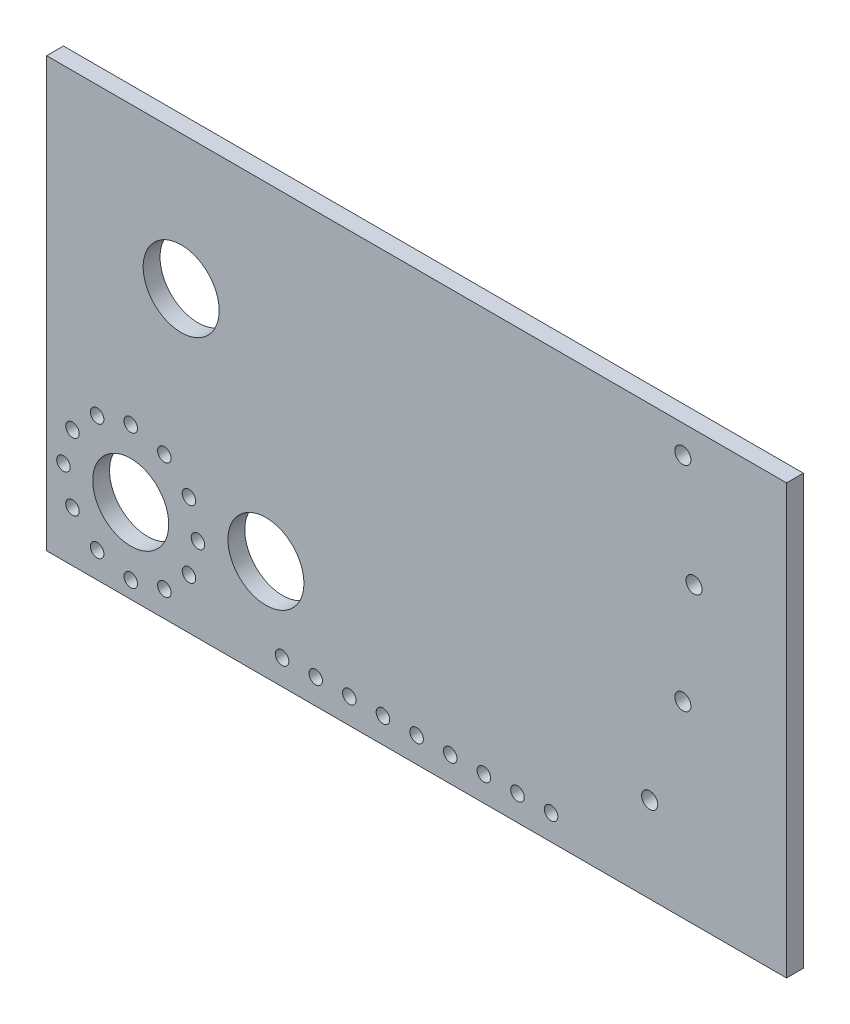
ISO-10303-21;
HEADER;
FILE_DESCRIPTION(('STEP AP214'),'2;1');
FILE_NAME('part.step','',(''),(''),'','','');
FILE_SCHEMA(('AUTOMOTIVE_DESIGN { 1 0 10303 214 1 1 1 1 }'));
ENDSEC;
DATA;
#1=APPLICATION_CONTEXT('core data for automotive mechanical design processes');
#2=APPLICATION_PROTOCOL_DEFINITION('international standard','automotive_design',2000,#1);
#3=PRODUCT_CONTEXT('',#1,'mechanical');
#4=PRODUCT('Part','Part','',(#3));
#5=PRODUCT_RELATED_PRODUCT_CATEGORY('part','',(#4));
#6=PRODUCT_DEFINITION_FORMATION('','',#4);
#7=PRODUCT_DEFINITION_CONTEXT('part definition',#1,'design');
#8=PRODUCT_DEFINITION('design','',#6,#7);
#9=PRODUCT_DEFINITION_SHAPE('','',#8);
#10=(LENGTH_UNIT() NAMED_UNIT(*) SI_UNIT(.MILLI.,.METRE.));
#11=(NAMED_UNIT(*) PLANE_ANGLE_UNIT() SI_UNIT($,.RADIAN.));
#12=(NAMED_UNIT(*) SI_UNIT($,.STERADIAN.) SOLID_ANGLE_UNIT());
#13=UNCERTAINTY_MEASURE_WITH_UNIT(LENGTH_MEASURE(1.E-05),#10,'distance_accuracy_value','');
#14=(GEOMETRIC_REPRESENTATION_CONTEXT(3) GLOBAL_UNCERTAINTY_ASSIGNED_CONTEXT((#13)) GLOBAL_UNIT_ASSIGNED_CONTEXT((#10,
#11,#12)) REPRESENTATION_CONTEXT('',''));
#15=CARTESIAN_POINT('',(0.,0.,0.));
#16=DIRECTION('',(0.,0.,1.));
#17=DIRECTION('',(1.,0.,0.));
#18=AXIS2_PLACEMENT_3D('',#15,#16,#17);
#19=CARTESIAN_POINT('',(0.,0.,6.35));
#20=DIRECTION('',(0.,0.,-1.));
#21=DIRECTION('',(-1.,0.,0.));
#22=AXIS2_PLACEMENT_3D('',#19,#20,#21);
#23=PLANE('',#22);
#24=DIRECTION('',(1.,0.,0.));
#25=VECTOR('',#24,1.);
#26=CARTESIAN_POINT('',(0.,-9.525,6.35));
#27=LINE('',#26,#25);
#28=CARTESIAN_POINT('',(-139.7,-9.52500000000002,6.35));
#29=VERTEX_POINT('',#28);
#30=CARTESIAN_POINT('',(139.7,-9.525,6.35));
#31=VERTEX_POINT('',#30);
#32=EDGE_CURVE('E56',#29,#31,#27,.T.);
#33=ORIENTED_EDGE('',*,*,#32,.T.);
#34=DIRECTION('',(0.,1.,0.));
#35=VECTOR('',#34,1.);
#36=CARTESIAN_POINT('',(139.7,152.4,6.35));
#37=LINE('',#36,#35);
#38=CARTESIAN_POINT('',(139.7,152.4,6.35));
#39=VERTEX_POINT('',#38);
#40=EDGE_CURVE('E87',#31,#39,#37,.T.);
#41=ORIENTED_EDGE('',*,*,#40,.T.);
#42=DIRECTION('',(-1.,0.,0.));
#43=VECTOR('',#42,1.);
#44=CARTESIAN_POINT('',(-139.7,152.4,6.35));
#45=LINE('',#44,#43);
#46=CARTESIAN_POINT('',(-139.7,152.4,6.35));
#47=VERTEX_POINT('',#46);
#48=EDGE_CURVE('E91',#39,#47,#45,.T.);
#49=ORIENTED_EDGE('',*,*,#48,.T.);
#50=DIRECTION('',(0.,-1.,0.));
#51=VECTOR('',#50,1.);
#52=CARTESIAN_POINT('',(-139.7,-9.52500000000002,6.35));
#53=LINE('',#52,#51);
#54=EDGE_CURVE('E98',#47,#29,#53,.T.);
#55=ORIENTED_EDGE('',*,*,#54,.T.);
#56=EDGE_LOOP('',(#33,#41,#49,#55));
#57=FACE_BOUND('',#56,.T.);
#58=CARTESIAN_POINT('',(0.,0.,6.35));
#59=DIRECTION('',(0.,0.,1.));
#60=DIRECTION('',(1.,0.,0.));
#61=AXIS2_PLACEMENT_3D('',#58,#59,#60);
#62=CIRCLE('',#61,2.5527);
#63=CARTESIAN_POINT('',(2.5527,0.,6.35));
#64=VERTEX_POINT('',#63);
#65=EDGE_CURVE('E105',#64,#64,#62,.T.);
#66=ORIENTED_EDGE('',*,*,#65,.F.);
#67=EDGE_LOOP('',(#66));
#68=FACE_BOUND('',#67,.T.);
#69=CARTESIAN_POINT('',(12.7,0.,6.35));
#70=DIRECTION('',(0.,0.,1.));
#71=DIRECTION('',(1.,0.,0.));
#72=AXIS2_PLACEMENT_3D('',#69,#70,#71);
#73=CIRCLE('',#72,2.5527);
#74=CARTESIAN_POINT('',(15.2527,0.,6.35));
#75=VERTEX_POINT('',#74);
#76=EDGE_CURVE('E406',#75,#75,#73,.T.);
#77=ORIENTED_EDGE('',*,*,#76,.F.);
#78=EDGE_LOOP('',(#77));
#79=FACE_BOUND('',#78,.T.);
#80=CARTESIAN_POINT('',(25.4,0.,6.35));
#81=DIRECTION('',(0.,0.,1.));
#82=DIRECTION('',(1.,0.,0.));
#83=AXIS2_PLACEMENT_3D('',#80,#81,#82);
#84=CIRCLE('',#83,2.5527);
#85=CARTESIAN_POINT('',(27.9527,0.,6.35));
#86=VERTEX_POINT('',#85);
#87=EDGE_CURVE('E400',#86,#86,#84,.T.);
#88=ORIENTED_EDGE('',*,*,#87,.F.);
#89=EDGE_LOOP('',(#88));
#90=FACE_BOUND('',#89,.T.);
#91=CARTESIAN_POINT('',(38.1,0.,6.35));
#92=DIRECTION('',(0.,0.,1.));
#93=DIRECTION('',(1.,0.,0.));
#94=AXIS2_PLACEMENT_3D('',#91,#92,#93);
#95=CIRCLE('',#94,2.5527);
#96=CARTESIAN_POINT('',(40.6527,0.,6.35));
#97=VERTEX_POINT('',#96);
#98=EDGE_CURVE('E394',#97,#97,#95,.T.);
#99=ORIENTED_EDGE('',*,*,#98,.F.);
#100=EDGE_LOOP('',(#99));
#101=FACE_BOUND('',#100,.T.);
#102=CARTESIAN_POINT('',(50.8,0.,6.35));
#103=DIRECTION('',(0.,0.,1.));
#104=DIRECTION('',(1.,0.,0.));
#105=AXIS2_PLACEMENT_3D('',#102,#103,#104);
#106=CIRCLE('',#105,2.5527);
#107=CARTESIAN_POINT('',(53.3527,0.,6.35));
#108=VERTEX_POINT('',#107);
#109=EDGE_CURVE('E388',#108,#108,#106,.T.);
#110=ORIENTED_EDGE('',*,*,#109,.F.);
#111=EDGE_LOOP('',(#110));
#112=FACE_BOUND('',#111,.T.);
#113=CARTESIAN_POINT('',(-50.8,0.,6.35));
#114=DIRECTION('',(0.,0.,1.));
#115=DIRECTION('',(-1.,0.,0.));
#116=AXIS2_PLACEMENT_3D('',#113,#114,#115);
#117=CIRCLE('',#116,2.5527);
#118=CARTESIAN_POINT('',(-53.3527,0.,6.35));
#119=VERTEX_POINT('',#118);
#120=EDGE_CURVE('E382',#119,#119,#117,.T.);
#121=ORIENTED_EDGE('',*,*,#120,.F.);
#122=EDGE_LOOP('',(#121));
#123=FACE_BOUND('',#122,.T.);
#124=CARTESIAN_POINT('',(-38.1,0.,6.35));
#125=DIRECTION('',(0.,0.,1.));
#126=DIRECTION('',(-1.,0.,0.));
#127=AXIS2_PLACEMENT_3D('',#124,#125,#126);
#128=CIRCLE('',#127,2.5527);
#129=CARTESIAN_POINT('',(-40.6527,0.,6.35));
#130=VERTEX_POINT('',#129);
#131=EDGE_CURVE('E376',#130,#130,#128,.T.);
#132=ORIENTED_EDGE('',*,*,#131,.F.);
#133=EDGE_LOOP('',(#132));
#134=FACE_BOUND('',#133,.T.);
#135=CARTESIAN_POINT('',(-25.4,0.,6.35));
#136=DIRECTION('',(0.,0.,1.));
#137=DIRECTION('',(-1.,0.,0.));
#138=AXIS2_PLACEMENT_3D('',#135,#136,#137);
#139=CIRCLE('',#138,2.5527);
#140=CARTESIAN_POINT('',(-27.9527,0.,6.35));
#141=VERTEX_POINT('',#140);
#142=EDGE_CURVE('E370',#141,#141,#139,.T.);
#143=ORIENTED_EDGE('',*,*,#142,.F.);
#144=EDGE_LOOP('',(#143));
#145=FACE_BOUND('',#144,.T.);
#146=CARTESIAN_POINT('',(-12.7,0.,6.35));
#147=DIRECTION('',(0.,0.,1.));
#148=DIRECTION('',(-1.,0.,0.));
#149=AXIS2_PLACEMENT_3D('',#146,#147,#148);
#150=CIRCLE('',#149,2.5527);
#151=CARTESIAN_POINT('',(-15.2527,0.,6.35));
#152=VERTEX_POINT('',#151);
#153=EDGE_CURVE('E364',#152,#152,#150,.T.);
#154=ORIENTED_EDGE('',*,*,#153,.F.);
#155=EDGE_LOOP('',(#154));
#156=FACE_BOUND('',#155,.T.);
#157=CARTESIAN_POINT('',(-82.55,22.225,6.35));
#158=DIRECTION('',(0.,0.,1.));
#159=DIRECTION('',(1.,0.,0.));
#160=AXIS2_PLACEMENT_3D('',#157,#158,#159);
#161=CIRCLE('',#160,2.55270000000001);
#162=CARTESIAN_POINT('',(-79.9973,22.225,6.35));
#163=VERTEX_POINT('',#162);
#164=EDGE_CURVE('E358',#163,#163,#161,.T.);
#165=ORIENTED_EDGE('',*,*,#164,.F.);
#166=EDGE_LOOP('',(#165));
#167=FACE_BOUND('',#166,.T.);
#168=CARTESIAN_POINT('',(-85.9529547438752,9.52499999999998,6.35));
#169=DIRECTION('',(0.,0.,1.));
#170=DIRECTION('',(1.,0.,0.));
#171=AXIS2_PLACEMENT_3D('',#168,#169,#170);
#172=CIRCLE('',#171,2.55269999999998);
#173=CARTESIAN_POINT('',(-83.4002547438753,9.52499999999998,6.35));
#174=VERTEX_POINT('',#173);
#175=EDGE_CURVE('E352',#174,#174,#172,.T.);
#176=ORIENTED_EDGE('',*,*,#175,.F.);
#177=EDGE_LOOP('',(#176));
#178=FACE_BOUND('',#177,.T.);
#179=CARTESIAN_POINT('',(-95.25,0.227954743875255,6.35));
#180=DIRECTION('',(0.,0.,1.));
#181=DIRECTION('',(1.,0.,0.));
#182=AXIS2_PLACEMENT_3D('',#179,#180,#181);
#183=CIRCLE('',#182,2.55270000000003);
#184=CARTESIAN_POINT('',(-92.6973,0.227954743875255,6.35));
#185=VERTEX_POINT('',#184);
#186=EDGE_CURVE('E346',#185,#185,#183,.T.);
#187=ORIENTED_EDGE('',*,*,#186,.F.);
#188=EDGE_LOOP('',(#187));
#189=FACE_BOUND('',#188,.T.);
#190=CARTESIAN_POINT('',(-107.95,-3.17500000000003,6.35));
#191=DIRECTION('',(0.,0.,1.));
#192=DIRECTION('',(1.,0.,0.));
#193=AXIS2_PLACEMENT_3D('',#190,#191,#192);
#194=CIRCLE('',#193,2.55269999999998);
#195=CARTESIAN_POINT('',(-105.3973,-3.17500000000003,6.35));
#196=VERTEX_POINT('',#195);
#197=EDGE_CURVE('E340',#196,#196,#194,.T.);
#198=ORIENTED_EDGE('',*,*,#197,.F.);
#199=EDGE_LOOP('',(#198));
#200=FACE_BOUND('',#199,.T.);
#201=CARTESIAN_POINT('',(-120.65,0.227954743875235,6.35));
#202=DIRECTION('',(0.,0.,1.));
#203=DIRECTION('',(1.,0.,0.));
#204=AXIS2_PLACEMENT_3D('',#201,#202,#203);
#205=CIRCLE('',#204,2.55269999999998);
#206=CARTESIAN_POINT('',(-118.0973,0.227954743875235,6.35));
#207=VERTEX_POINT('',#206);
#208=EDGE_CURVE('E334',#207,#207,#205,.T.);
#209=ORIENTED_EDGE('',*,*,#208,.F.);
#210=EDGE_LOOP('',(#209));
#211=FACE_BOUND('',#210,.T.);
#212=CARTESIAN_POINT('',(-129.947045256125,9.52499999999998,6.35));
#213=DIRECTION('',(0.,0.,1.));
#214=DIRECTION('',(1.,0.,0.));
#215=AXIS2_PLACEMENT_3D('',#212,#213,#214);
#216=CIRCLE('',#215,2.55270000000001);
#217=CARTESIAN_POINT('',(-127.394345256125,9.52499999999998,6.35));
#218=VERTEX_POINT('',#217);
#219=EDGE_CURVE('E328',#218,#218,#216,.T.);
#220=ORIENTED_EDGE('',*,*,#219,.F.);
#221=EDGE_LOOP('',(#220));
#222=FACE_BOUND('',#221,.T.);
#223=CARTESIAN_POINT('',(-133.35,22.225,6.35));
#224=DIRECTION('',(0.,0.,1.));
#225=DIRECTION('',(1.,0.,0.));
#226=AXIS2_PLACEMENT_3D('',#223,#224,#225);
#227=CIRCLE('',#226,2.55270000000001);
#228=CARTESIAN_POINT('',(-130.7973,22.225,6.35));
#229=VERTEX_POINT('',#228);
#230=EDGE_CURVE('E322',#229,#229,#227,.T.);
#231=ORIENTED_EDGE('',*,*,#230,.F.);
#232=EDGE_LOOP('',(#231));
#233=FACE_BOUND('',#232,.T.);
#234=CARTESIAN_POINT('',(-129.947045256125,34.925,6.35));
#235=DIRECTION('',(0.,0.,1.));
#236=DIRECTION('',(1.,0.,0.));
#237=AXIS2_PLACEMENT_3D('',#234,#235,#236);
#238=CIRCLE('',#237,2.55270000000004);
#239=CARTESIAN_POINT('',(-127.394345256125,34.925,6.35));
#240=VERTEX_POINT('',#239);
#241=EDGE_CURVE('E316',#240,#240,#238,.T.);
#242=ORIENTED_EDGE('',*,*,#241,.F.);
#243=EDGE_LOOP('',(#242));
#244=FACE_BOUND('',#243,.T.);
#245=CARTESIAN_POINT('',(-120.65,44.2220452561247,6.35));
#246=DIRECTION('',(0.,0.,1.));
#247=DIRECTION('',(1.,0.,0.));
#248=AXIS2_PLACEMENT_3D('',#245,#246,#247);
#249=CIRCLE('',#248,2.55270000000003);
#250=CARTESIAN_POINT('',(-118.0973,44.2220452561247,6.35));
#251=VERTEX_POINT('',#250);
#252=EDGE_CURVE('E310',#251,#251,#249,.T.);
#253=ORIENTED_EDGE('',*,*,#252,.F.);
#254=EDGE_LOOP('',(#253));
#255=FACE_BOUND('',#254,.T.);
#256=CARTESIAN_POINT('',(-107.95,47.625,6.35));
#257=DIRECTION('',(0.,0.,1.));
#258=DIRECTION('',(1.,0.,0.));
#259=AXIS2_PLACEMENT_3D('',#256,#257,#258);
#260=CIRCLE('',#259,2.55269999999998);
#261=CARTESIAN_POINT('',(-105.3973,47.625,6.35));
#262=VERTEX_POINT('',#261);
#263=EDGE_CURVE('E304',#262,#262,#260,.T.);
#264=ORIENTED_EDGE('',*,*,#263,.F.);
#265=EDGE_LOOP('',(#264));
#266=FACE_BOUND('',#265,.T.);
#267=CARTESIAN_POINT('',(-95.25,44.2220452561247,6.35));
#268=DIRECTION('',(0.,0.,1.));
#269=DIRECTION('',(1.,0.,0.));
#270=AXIS2_PLACEMENT_3D('',#267,#268,#269);
#271=CIRCLE('',#270,2.55270000000003);
#272=CARTESIAN_POINT('',(-92.6973,44.2220452561247,6.35));
#273=VERTEX_POINT('',#272);
#274=EDGE_CURVE('E298',#273,#273,#271,.T.);
#275=ORIENTED_EDGE('',*,*,#274,.F.);
#276=EDGE_LOOP('',(#275));
#277=FACE_BOUND('',#276,.T.);
#278=CARTESIAN_POINT('',(-85.9529547438752,34.925,6.35));
#279=DIRECTION('',(0.,0.,1.));
#280=DIRECTION('',(1.,0.,0.));
#281=AXIS2_PLACEMENT_3D('',#278,#279,#280);
#282=CIRCLE('',#281,2.55270000000003);
#283=CARTESIAN_POINT('',(-83.4002547438752,34.925,6.35));
#284=VERTEX_POINT('',#283);
#285=EDGE_CURVE('E292',#284,#284,#282,.T.);
#286=ORIENTED_EDGE('',*,*,#285,.F.);
#287=EDGE_LOOP('',(#286));
#288=FACE_BOUND('',#287,.T.);
#289=CARTESIAN_POINT('',(100.54273657212,141.867296719128,6.35));
#290=DIRECTION('',(0.,0.,1.));
#291=DIRECTION('',(1.,0.,0.));
#292=AXIS2_PLACEMENT_3D('',#289,#290,#291);
#293=CIRCLE('',#292,3.048);
#294=CARTESIAN_POINT('',(103.59073657212,141.867296719128,6.35));
#295=VERTEX_POINT('',#294);
#296=EDGE_CURVE('E286',#295,#295,#293,.T.);
#297=ORIENTED_EDGE('',*,*,#296,.F.);
#298=EDGE_LOOP('',(#297));
#299=FACE_BOUND('',#298,.T.);
#300=CARTESIAN_POINT('',(104.775,101.6,6.35));
#301=DIRECTION('',(0.,0.,1.));
#302=DIRECTION('',(1.,0.,0.));
#303=AXIS2_PLACEMENT_3D('',#300,#301,#302);
#304=CIRCLE('',#303,3.048);
#305=CARTESIAN_POINT('',(107.823,101.6,6.35));
#306=VERTEX_POINT('',#305);
#307=EDGE_CURVE('E280',#306,#306,#304,.T.);
#308=ORIENTED_EDGE('',*,*,#307,.F.);
#309=EDGE_LOOP('',(#308));
#310=FACE_BOUND('',#309,.T.);
#311=CARTESIAN_POINT('',(100.54273657212,61.3327032808718,6.35));
#312=DIRECTION('',(0.,0.,1.));
#313=DIRECTION('',(1.,0.,0.));
#314=AXIS2_PLACEMENT_3D('',#311,#312,#313);
#315=CIRCLE('',#314,3.048);
#316=CARTESIAN_POINT('',(103.59073657212,61.3327032808718,6.35));
#317=VERTEX_POINT('',#316);
#318=EDGE_CURVE('E274',#317,#317,#315,.T.);
#319=ORIENTED_EDGE('',*,*,#318,.F.);
#320=EDGE_LOOP('',(#319));
#321=FACE_BOUND('',#320,.T.);
#322=CARTESIAN_POINT('',(88.0309165089319,22.8252806522969,6.35));
#323=DIRECTION('',(0.,0.,1.));
#324=DIRECTION('',(1.,0.,0.));
#325=AXIS2_PLACEMENT_3D('',#322,#323,#324);
#326=CIRCLE('',#325,3.048);
#327=CARTESIAN_POINT('',(91.0789165089319,22.8252806522969,6.35));
#328=VERTEX_POINT('',#327);
#329=EDGE_CURVE('E268',#328,#328,#326,.T.);
#330=ORIENTED_EDGE('',*,*,#329,.F.);
#331=EDGE_LOOP('',(#330));
#332=FACE_BOUND('',#331,.T.);
#333=CARTESIAN_POINT('',(-107.95,22.225,6.35));
#334=DIRECTION('',(0.,0.,1.));
#335=DIRECTION('',(1.,0.,0.));
#336=AXIS2_PLACEMENT_3D('',#333,#334,#335);
#337=CIRCLE('',#336,14.351);
#338=CARTESIAN_POINT('',(-93.599,22.225,6.35));
#339=VERTEX_POINT('',#338);
#340=EDGE_CURVE('E262',#339,#339,#337,.T.);
#341=ORIENTED_EDGE('',*,*,#340,.F.);
#342=EDGE_LOOP('',(#341));
#343=FACE_BOUND('',#342,.T.);
#344=CARTESIAN_POINT('',(-88.9,101.6,6.35));
#345=DIRECTION('',(0.,0.,1.));
#346=DIRECTION('',(1.,0.,0.));
#347=AXIS2_PLACEMENT_3D('',#344,#345,#346);
#348=CIRCLE('',#347,14.351);
#349=CARTESIAN_POINT('',(-74.549,101.6,6.35));
#350=VERTEX_POINT('',#349);
#351=EDGE_CURVE('E256',#350,#350,#348,.T.);
#352=ORIENTED_EDGE('',*,*,#351,.F.);
#353=EDGE_LOOP('',(#352));
#354=FACE_BOUND('',#353,.T.);
#355=CARTESIAN_POINT('',(-56.8936740087812,28.4237940021104,6.35));
#356=DIRECTION('',(0.,0.,1.));
#357=DIRECTION('',(1.,0.,0.));
#358=AXIS2_PLACEMENT_3D('',#355,#356,#357);
#359=CIRCLE('',#358,14.351);
#360=CARTESIAN_POINT('',(-42.5426740087812,28.4237940021104,6.35));
#361=VERTEX_POINT('',#360);
#362=EDGE_CURVE('E247',#361,#361,#359,.T.);
#363=ORIENTED_EDGE('',*,*,#362,.F.);
#364=EDGE_LOOP('',(#363));
#365=FACE_BOUND('',#364,.T.);
#366=ADVANCED_FACE('F39',(#57,#68,#79,#90,#101,#112,#123,#134,#145,#156,#167,#178,#189,#200,
#211,#222,#233,#244,#255,#266,#277,#288,#299,#310,#321,#332,#343,#354,#365),#23,.F.);
#367=CARTESIAN_POINT('',(0.,0.,0.));
#368=DIRECTION('',(0.,0.,-1.));
#369=DIRECTION('',(-1.,0.,0.));
#370=AXIS2_PLACEMENT_3D('',#367,#368,#369);
#371=PLANE('',#370);
#372=CARTESIAN_POINT('',(-88.9,101.6,0.));
#373=DIRECTION('',(0.,0.,1.));
#374=DIRECTION('',(1.,0.,0.));
#375=AXIS2_PLACEMENT_3D('',#372,#373,#374);
#376=CIRCLE('',#375,14.351);
#377=CARTESIAN_POINT('',(-74.549,101.6,0.));
#378=VERTEX_POINT('',#377);
#379=EDGE_CURVE('E253',#378,#378,#376,.T.);
#380=ORIENTED_EDGE('',*,*,#379,.T.);
#381=EDGE_LOOP('',(#380));
#382=FACE_BOUND('',#381,.T.);
#383=CARTESIAN_POINT('',(88.0309165089319,22.8252806522969,0.));
#384=DIRECTION('',(0.,0.,1.));
#385=DIRECTION('',(1.,0.,0.));
#386=AXIS2_PLACEMENT_3D('',#383,#384,#385);
#387=CIRCLE('',#386,3.048);
#388=CARTESIAN_POINT('',(91.0789165089319,22.8252806522969,0.));
#389=VERTEX_POINT('',#388);
#390=EDGE_CURVE('E265',#389,#389,#387,.T.);
#391=ORIENTED_EDGE('',*,*,#390,.T.);
#392=EDGE_LOOP('',(#391));
#393=FACE_BOUND('',#392,.T.);
#394=CARTESIAN_POINT('',(104.775,101.6,0.));
#395=DIRECTION('',(0.,0.,1.));
#396=DIRECTION('',(1.,0.,0.));
#397=AXIS2_PLACEMENT_3D('',#394,#395,#396);
#398=CIRCLE('',#397,3.048);
#399=CARTESIAN_POINT('',(107.823,101.6,0.));
#400=VERTEX_POINT('',#399);
#401=EDGE_CURVE('E277',#400,#400,#398,.T.);
#402=ORIENTED_EDGE('',*,*,#401,.T.);
#403=EDGE_LOOP('',(#402));
#404=FACE_BOUND('',#403,.T.);
#405=CARTESIAN_POINT('',(-85.9529547438752,34.925,0.));
#406=DIRECTION('',(0.,0.,1.));
#407=DIRECTION('',(1.,0.,0.));
#408=AXIS2_PLACEMENT_3D('',#405,#406,#407);
#409=CIRCLE('',#408,2.55270000000003);
#410=CARTESIAN_POINT('',(-83.4002547438752,34.925,0.));
#411=VERTEX_POINT('',#410);
#412=EDGE_CURVE('E289',#411,#411,#409,.T.);
#413=ORIENTED_EDGE('',*,*,#412,.T.);
#414=EDGE_LOOP('',(#413));
#415=FACE_BOUND('',#414,.T.);
#416=CARTESIAN_POINT('',(-107.95,47.625,0.));
#417=DIRECTION('',(0.,0.,1.));
#418=DIRECTION('',(1.,0.,0.));
#419=AXIS2_PLACEMENT_3D('',#416,#417,#418);
#420=CIRCLE('',#419,2.55269999999998);
#421=CARTESIAN_POINT('',(-105.3973,47.625,0.));
#422=VERTEX_POINT('',#421);
#423=EDGE_CURVE('E301',#422,#422,#420,.T.);
#424=ORIENTED_EDGE('',*,*,#423,.T.);
#425=EDGE_LOOP('',(#424));
#426=FACE_BOUND('',#425,.T.);
#427=CARTESIAN_POINT('',(-129.947045256125,34.925,0.));
#428=DIRECTION('',(0.,0.,1.));
#429=DIRECTION('',(1.,0.,0.));
#430=AXIS2_PLACEMENT_3D('',#427,#428,#429);
#431=CIRCLE('',#430,2.55270000000004);
#432=CARTESIAN_POINT('',(-127.394345256125,34.925,0.));
#433=VERTEX_POINT('',#432);
#434=EDGE_CURVE('E313',#433,#433,#431,.T.);
#435=ORIENTED_EDGE('',*,*,#434,.T.);
#436=EDGE_LOOP('',(#435));
#437=FACE_BOUND('',#436,.T.);
#438=CARTESIAN_POINT('',(-129.947045256125,9.52499999999998,0.));
#439=DIRECTION('',(0.,0.,1.));
#440=DIRECTION('',(1.,0.,0.));
#441=AXIS2_PLACEMENT_3D('',#438,#439,#440);
#442=CIRCLE('',#441,2.55270000000001);
#443=CARTESIAN_POINT('',(-127.394345256125,9.52499999999998,0.));
#444=VERTEX_POINT('',#443);
#445=EDGE_CURVE('E325',#444,#444,#442,.T.);
#446=ORIENTED_EDGE('',*,*,#445,.T.);
#447=EDGE_LOOP('',(#446));
#448=FACE_BOUND('',#447,.T.);
#449=CARTESIAN_POINT('',(-107.95,-3.17500000000003,0.));
#450=DIRECTION('',(0.,0.,1.));
#451=DIRECTION('',(1.,0.,0.));
#452=AXIS2_PLACEMENT_3D('',#449,#450,#451);
#453=CIRCLE('',#452,2.55269999999998);
#454=CARTESIAN_POINT('',(-105.3973,-3.17500000000003,0.));
#455=VERTEX_POINT('',#454);
#456=EDGE_CURVE('E337',#455,#455,#453,.T.);
#457=ORIENTED_EDGE('',*,*,#456,.T.);
#458=EDGE_LOOP('',(#457));
#459=FACE_BOUND('',#458,.T.);
#460=CARTESIAN_POINT('',(-85.9529547438752,9.52499999999998,0.));
#461=DIRECTION('',(0.,0.,1.));
#462=DIRECTION('',(1.,0.,0.));
#463=AXIS2_PLACEMENT_3D('',#460,#461,#462);
#464=CIRCLE('',#463,2.55269999999998);
#465=CARTESIAN_POINT('',(-83.4002547438753,9.52499999999998,0.));
#466=VERTEX_POINT('',#465);
#467=EDGE_CURVE('E349',#466,#466,#464,.T.);
#468=ORIENTED_EDGE('',*,*,#467,.T.);
#469=EDGE_LOOP('',(#468));
#470=FACE_BOUND('',#469,.T.);
#471=CARTESIAN_POINT('',(-12.7,0.,0.));
#472=DIRECTION('',(0.,0.,1.));
#473=DIRECTION('',(-1.,0.,0.));
#474=AXIS2_PLACEMENT_3D('',#471,#472,#473);
#475=CIRCLE('',#474,2.5527);
#476=CARTESIAN_POINT('',(-15.2527,0.,0.));
#477=VERTEX_POINT('',#476);
#478=EDGE_CURVE('E361',#477,#477,#475,.T.);
#479=ORIENTED_EDGE('',*,*,#478,.T.);
#480=EDGE_LOOP('',(#479));
#481=FACE_BOUND('',#480,.T.);
#482=CARTESIAN_POINT('',(-38.1,0.,0.));
#483=DIRECTION('',(0.,0.,1.));
#484=DIRECTION('',(-1.,0.,0.));
#485=AXIS2_PLACEMENT_3D('',#482,#483,#484);
#486=CIRCLE('',#485,2.5527);
#487=CARTESIAN_POINT('',(-40.6527,0.,0.));
#488=VERTEX_POINT('',#487);
#489=EDGE_CURVE('E373',#488,#488,#486,.T.);
#490=ORIENTED_EDGE('',*,*,#489,.T.);
#491=EDGE_LOOP('',(#490));
#492=FACE_BOUND('',#491,.T.);
#493=CARTESIAN_POINT('',(50.8,0.,0.));
#494=DIRECTION('',(0.,0.,1.));
#495=DIRECTION('',(1.,0.,0.));
#496=AXIS2_PLACEMENT_3D('',#493,#494,#495);
#497=CIRCLE('',#496,2.5527);
#498=CARTESIAN_POINT('',(53.3527,0.,0.));
#499=VERTEX_POINT('',#498);
#500=EDGE_CURVE('E385',#499,#499,#497,.T.);
#501=ORIENTED_EDGE('',*,*,#500,.T.);
#502=EDGE_LOOP('',(#501));
#503=FACE_BOUND('',#502,.T.);
#504=CARTESIAN_POINT('',(25.4,0.,0.));
#505=DIRECTION('',(0.,0.,1.));
#506=DIRECTION('',(1.,0.,0.));
#507=AXIS2_PLACEMENT_3D('',#504,#505,#506);
#508=CIRCLE('',#507,2.5527);
#509=CARTESIAN_POINT('',(27.9527,0.,0.));
#510=VERTEX_POINT('',#509);
#511=EDGE_CURVE('E397',#510,#510,#508,.T.);
#512=ORIENTED_EDGE('',*,*,#511,.T.);
#513=EDGE_LOOP('',(#512));
#514=FACE_BOUND('',#513,.T.);
#515=CARTESIAN_POINT('',(0.,0.,0.));
#516=DIRECTION('',(0.,0.,1.));
#517=DIRECTION('',(1.,0.,0.));
#518=AXIS2_PLACEMENT_3D('',#515,#516,#517);
#519=CIRCLE('',#518,2.5527);
#520=CARTESIAN_POINT('',(2.5527,0.,0.));
#521=VERTEX_POINT('',#520);
#522=EDGE_CURVE('E409',#521,#521,#519,.T.);
#523=ORIENTED_EDGE('',*,*,#522,.T.);
#524=EDGE_LOOP('',(#523));
#525=FACE_BOUND('',#524,.T.);
#526=DIRECTION('',(0.,1.,0.));
#527=VECTOR('',#526,1.);
#528=CARTESIAN_POINT('',(139.7,152.4,0.));
#529=LINE('',#528,#527);
#530=CARTESIAN_POINT('',(139.7,-9.525,0.));
#531=VERTEX_POINT('',#530);
#532=CARTESIAN_POINT('',(139.7,152.4,0.));
#533=VERTEX_POINT('',#532);
#534=EDGE_CURVE('E94',#531,#533,#529,.T.);
#535=ORIENTED_EDGE('',*,*,#534,.F.);
#536=DIRECTION('',(1.,0.,0.));
#537=VECTOR('',#536,1.);
#538=CARTESIAN_POINT('',(0.,-9.525,0.));
#539=LINE('',#538,#537);
#540=CARTESIAN_POINT('',(-139.7,-9.52500000000002,0.));
#541=VERTEX_POINT('',#540);
#542=EDGE_CURVE('E108',#541,#531,#539,.T.);
#543=ORIENTED_EDGE('',*,*,#542,.F.);
#544=DIRECTION('',(0.,-1.,0.));
#545=VECTOR('',#544,1.);
#546=CARTESIAN_POINT('',(-139.7,-9.52500000000002,0.));
#547=LINE('',#546,#545);
#548=CARTESIAN_POINT('',(-139.7,152.4,0.));
#549=VERTEX_POINT('',#548);
#550=EDGE_CURVE('E81',#549,#541,#547,.T.);
#551=ORIENTED_EDGE('',*,*,#550,.F.);
#552=DIRECTION('',(-1.,0.,0.));
#553=VECTOR('',#552,1.);
#554=CARTESIAN_POINT('',(-139.7,152.4,0.));
#555=LINE('',#554,#553);
#556=EDGE_CURVE('E74',#533,#549,#555,.T.);
#557=ORIENTED_EDGE('',*,*,#556,.F.);
#558=EDGE_LOOP('',(#535,#543,#551,#557));
#559=FACE_BOUND('',#558,.T.);
#560=CARTESIAN_POINT('',(12.7,0.,0.));
#561=DIRECTION('',(0.,0.,1.));
#562=DIRECTION('',(1.,0.,0.));
#563=AXIS2_PLACEMENT_3D('',#560,#561,#562);
#564=CIRCLE('',#563,2.5527);
#565=CARTESIAN_POINT('',(15.2527,0.,0.));
#566=VERTEX_POINT('',#565);
#567=EDGE_CURVE('E403',#566,#566,#564,.T.);
#568=ORIENTED_EDGE('',*,*,#567,.T.);
#569=EDGE_LOOP('',(#568));
#570=FACE_BOUND('',#569,.T.);
#571=CARTESIAN_POINT('',(38.1,0.,0.));
#572=DIRECTION('',(0.,0.,1.));
#573=DIRECTION('',(1.,0.,0.));
#574=AXIS2_PLACEMENT_3D('',#571,#572,#573);
#575=CIRCLE('',#574,2.5527);
#576=CARTESIAN_POINT('',(40.6527,0.,0.));
#577=VERTEX_POINT('',#576);
#578=EDGE_CURVE('E391',#577,#577,#575,.T.);
#579=ORIENTED_EDGE('',*,*,#578,.T.);
#580=EDGE_LOOP('',(#579));
#581=FACE_BOUND('',#580,.T.);
#582=CARTESIAN_POINT('',(-50.8,0.,0.));
#583=DIRECTION('',(0.,0.,1.));
#584=DIRECTION('',(-1.,0.,0.));
#585=AXIS2_PLACEMENT_3D('',#582,#583,#584);
#586=CIRCLE('',#585,2.5527);
#587=CARTESIAN_POINT('',(-53.3527,0.,0.));
#588=VERTEX_POINT('',#587);
#589=EDGE_CURVE('E379',#588,#588,#586,.T.);
#590=ORIENTED_EDGE('',*,*,#589,.T.);
#591=EDGE_LOOP('',(#590));
#592=FACE_BOUND('',#591,.T.);
#593=CARTESIAN_POINT('',(-25.4,0.,0.));
#594=DIRECTION('',(0.,0.,1.));
#595=DIRECTION('',(-1.,0.,0.));
#596=AXIS2_PLACEMENT_3D('',#593,#594,#595);
#597=CIRCLE('',#596,2.5527);
#598=CARTESIAN_POINT('',(-27.9527,0.,0.));
#599=VERTEX_POINT('',#598);
#600=EDGE_CURVE('E367',#599,#599,#597,.T.);
#601=ORIENTED_EDGE('',*,*,#600,.T.);
#602=EDGE_LOOP('',(#601));
#603=FACE_BOUND('',#602,.T.);
#604=CARTESIAN_POINT('',(-82.55,22.225,0.));
#605=DIRECTION('',(0.,0.,1.));
#606=DIRECTION('',(1.,0.,0.));
#607=AXIS2_PLACEMENT_3D('',#604,#605,#606);
#608=CIRCLE('',#607,2.55270000000001);
#609=CARTESIAN_POINT('',(-79.9973,22.225,0.));
#610=VERTEX_POINT('',#609);
#611=EDGE_CURVE('E355',#610,#610,#608,.T.);
#612=ORIENTED_EDGE('',*,*,#611,.T.);
#613=EDGE_LOOP('',(#612));
#614=FACE_BOUND('',#613,.T.);
#615=CARTESIAN_POINT('',(-95.25,0.227954743875255,0.));
#616=DIRECTION('',(0.,0.,1.));
#617=DIRECTION('',(1.,0.,0.));
#618=AXIS2_PLACEMENT_3D('',#615,#616,#617);
#619=CIRCLE('',#618,2.55270000000003);
#620=CARTESIAN_POINT('',(-92.6973,0.227954743875255,0.));
#621=VERTEX_POINT('',#620);
#622=EDGE_CURVE('E343',#621,#621,#619,.T.);
#623=ORIENTED_EDGE('',*,*,#622,.T.);
#624=EDGE_LOOP('',(#623));
#625=FACE_BOUND('',#624,.T.);
#626=CARTESIAN_POINT('',(-120.65,0.227954743875235,0.));
#627=DIRECTION('',(0.,0.,1.));
#628=DIRECTION('',(1.,0.,0.));
#629=AXIS2_PLACEMENT_3D('',#626,#627,#628);
#630=CIRCLE('',#629,2.55269999999998);
#631=CARTESIAN_POINT('',(-118.0973,0.227954743875235,0.));
#632=VERTEX_POINT('',#631);
#633=EDGE_CURVE('E331',#632,#632,#630,.T.);
#634=ORIENTED_EDGE('',*,*,#633,.T.);
#635=EDGE_LOOP('',(#634));
#636=FACE_BOUND('',#635,.T.);
#637=CARTESIAN_POINT('',(-133.35,22.225,0.));
#638=DIRECTION('',(0.,0.,1.));
#639=DIRECTION('',(1.,0.,0.));
#640=AXIS2_PLACEMENT_3D('',#637,#638,#639);
#641=CIRCLE('',#640,2.55270000000001);
#642=CARTESIAN_POINT('',(-130.7973,22.225,0.));
#643=VERTEX_POINT('',#642);
#644=EDGE_CURVE('E319',#643,#643,#641,.T.);
#645=ORIENTED_EDGE('',*,*,#644,.T.);
#646=EDGE_LOOP('',(#645));
#647=FACE_BOUND('',#646,.T.);
#648=CARTESIAN_POINT('',(-120.65,44.2220452561247,0.));
#649=DIRECTION('',(0.,0.,1.));
#650=DIRECTION('',(1.,0.,0.));
#651=AXIS2_PLACEMENT_3D('',#648,#649,#650);
#652=CIRCLE('',#651,2.55270000000003);
#653=CARTESIAN_POINT('',(-118.0973,44.2220452561247,0.));
#654=VERTEX_POINT('',#653);
#655=EDGE_CURVE('E307',#654,#654,#652,.T.);
#656=ORIENTED_EDGE('',*,*,#655,.T.);
#657=EDGE_LOOP('',(#656));
#658=FACE_BOUND('',#657,.T.);
#659=CARTESIAN_POINT('',(-95.25,44.2220452561247,0.));
#660=DIRECTION('',(0.,0.,1.));
#661=DIRECTION('',(1.,0.,0.));
#662=AXIS2_PLACEMENT_3D('',#659,#660,#661);
#663=CIRCLE('',#662,2.55270000000003);
#664=CARTESIAN_POINT('',(-92.6973,44.2220452561247,0.));
#665=VERTEX_POINT('',#664);
#666=EDGE_CURVE('E295',#665,#665,#663,.T.);
#667=ORIENTED_EDGE('',*,*,#666,.T.);
#668=EDGE_LOOP('',(#667));
#669=FACE_BOUND('',#668,.T.);
#670=CARTESIAN_POINT('',(100.54273657212,141.867296719128,0.));
#671=DIRECTION('',(0.,0.,1.));
#672=DIRECTION('',(1.,0.,0.));
#673=AXIS2_PLACEMENT_3D('',#670,#671,#672);
#674=CIRCLE('',#673,3.048);
#675=CARTESIAN_POINT('',(103.59073657212,141.867296719128,0.));
#676=VERTEX_POINT('',#675);
#677=EDGE_CURVE('E283',#676,#676,#674,.T.);
#678=ORIENTED_EDGE('',*,*,#677,.T.);
#679=EDGE_LOOP('',(#678));
#680=FACE_BOUND('',#679,.T.);
#681=CARTESIAN_POINT('',(100.54273657212,61.3327032808718,0.));
#682=DIRECTION('',(0.,0.,1.));
#683=DIRECTION('',(1.,0.,0.));
#684=AXIS2_PLACEMENT_3D('',#681,#682,#683);
#685=CIRCLE('',#684,3.048);
#686=CARTESIAN_POINT('',(103.59073657212,61.3327032808718,0.));
#687=VERTEX_POINT('',#686);
#688=EDGE_CURVE('E271',#687,#687,#685,.T.);
#689=ORIENTED_EDGE('',*,*,#688,.T.);
#690=EDGE_LOOP('',(#689));
#691=FACE_BOUND('',#690,.T.);
#692=CARTESIAN_POINT('',(-107.95,22.225,0.));
#693=DIRECTION('',(0.,0.,1.));
#694=DIRECTION('',(1.,0.,0.));
#695=AXIS2_PLACEMENT_3D('',#692,#693,#694);
#696=CIRCLE('',#695,14.351);
#697=CARTESIAN_POINT('',(-93.599,22.225,0.));
#698=VERTEX_POINT('',#697);
#699=EDGE_CURVE('E259',#698,#698,#696,.T.);
#700=ORIENTED_EDGE('',*,*,#699,.T.);
#701=EDGE_LOOP('',(#700));
#702=FACE_BOUND('',#701,.T.);
#703=CARTESIAN_POINT('',(-56.8936740087812,28.4237940021104,0.));
#704=DIRECTION('',(0.,0.,1.));
#705=DIRECTION('',(1.,0.,0.));
#706=AXIS2_PLACEMENT_3D('',#703,#704,#705);
#707=CIRCLE('',#706,14.351);
#708=CARTESIAN_POINT('',(-42.5426740087812,28.4237940021104,0.));
#709=VERTEX_POINT('',#708);
#710=EDGE_CURVE('E250',#709,#709,#707,.T.);
#711=ORIENTED_EDGE('',*,*,#710,.T.);
#712=EDGE_LOOP('',(#711));
#713=FACE_BOUND('',#712,.T.);
#714=ADVANCED_FACE('F114',(#382,#393,#404,#415,#426,#437,#448,#459,#470,#481,#492,#503,#514,
#525,#559,#570,#581,#592,#603,#614,#625,#636,#647,#658,#669,#680,#691,#702,#713),#371,.T.);
#715=CARTESIAN_POINT('',(139.7,152.4,6.35));
#716=DIRECTION('',(-1.,0.,0.));
#717=DIRECTION('',(0.,-1.,0.));
#718=AXIS2_PLACEMENT_3D('',#715,#716,#717);
#719=PLANE('',#718);
#720=ORIENTED_EDGE('',*,*,#534,.T.);
#721=DIRECTION('',(0.,0.,-1.));
#722=VECTOR('',#721,1.);
#723=CARTESIAN_POINT('',(139.7,152.4,6.35));
#724=LINE('',#723,#722);
#725=EDGE_CURVE('E48',#39,#533,#724,.T.);
#726=ORIENTED_EDGE('',*,*,#725,.F.);
#727=ORIENTED_EDGE('',*,*,#40,.F.);
#728=DIRECTION('',(0.,0.,-1.));
#729=VECTOR('',#728,1.);
#730=CARTESIAN_POINT('',(139.7,-9.525,6.35));
#731=LINE('',#730,#729);
#732=EDGE_CURVE('E11',#31,#531,#731,.T.);
#733=ORIENTED_EDGE('',*,*,#732,.T.);
#734=EDGE_LOOP('',(#720,#726,#727,#733));
#735=FACE_BOUND('',#734,.T.);
#736=ADVANCED_FACE('F41',(#735),#719,.F.);
#737=CARTESIAN_POINT('',(-139.7,152.4,6.35));
#738=DIRECTION('',(0.,-1.,0.));
#739=DIRECTION('',(0.,0.,-1.));
#740=AXIS2_PLACEMENT_3D('',#737,#738,#739);
#741=PLANE('',#740);
#742=ORIENTED_EDGE('',*,*,#556,.T.);
#743=DIRECTION('',(0.,0.,-1.));
#744=VECTOR('',#743,1.);
#745=CARTESIAN_POINT('',(-139.7,152.4,6.35));
#746=LINE('',#745,#744);
#747=EDGE_CURVE('E95',#47,#549,#746,.T.);
#748=ORIENTED_EDGE('',*,*,#747,.F.);
#749=ORIENTED_EDGE('',*,*,#48,.F.);
#750=ORIENTED_EDGE('',*,*,#725,.T.);
#751=EDGE_LOOP('',(#742,#748,#749,#750));
#752=FACE_BOUND('',#751,.T.);
#753=ADVANCED_FACE('F96',(#752),#741,.F.);
#754=CARTESIAN_POINT('',(-139.7,-9.52500000000002,6.35));
#755=DIRECTION('',(1.,0.,0.));
#756=DIRECTION('',(0.,0.,-1.));
#757=AXIS2_PLACEMENT_3D('',#754,#755,#756);
#758=PLANE('',#757);
#759=ORIENTED_EDGE('',*,*,#550,.T.);
#760=DIRECTION('',(0.,0.,-1.));
#761=VECTOR('',#760,1.);
#762=CARTESIAN_POINT('',(-139.7,-9.52500000000002,6.35));
#763=LINE('',#762,#761);
#764=EDGE_CURVE('E100',#29,#541,#763,.T.);
#765=ORIENTED_EDGE('',*,*,#764,.F.);
#766=ORIENTED_EDGE('',*,*,#54,.F.);
#767=ORIENTED_EDGE('',*,*,#747,.T.);
#768=EDGE_LOOP('',(#759,#765,#766,#767));
#769=FACE_BOUND('',#768,.T.);
#770=ADVANCED_FACE('F111',(#769),#758,.F.);
#771=CARTESIAN_POINT('',(0.,-9.525,6.35));
#772=DIRECTION('',(0.,1.,0.));
#773=DIRECTION('',(-1.,0.,0.));
#774=AXIS2_PLACEMENT_3D('',#771,#772,#773);
#775=PLANE('',#774);
#776=ORIENTED_EDGE('',*,*,#542,.T.);
#777=ORIENTED_EDGE('',*,*,#732,.F.);
#778=ORIENTED_EDGE('',*,*,#32,.F.);
#779=ORIENTED_EDGE('',*,*,#764,.T.);
#780=EDGE_LOOP('',(#776,#777,#778,#779));
#781=FACE_BOUND('',#780,.T.);
#782=ADVANCED_FACE('F116',(#781),#775,.F.);
#783=CARTESIAN_POINT('',(0.,0.,6.35));
#784=DIRECTION('',(0.,0.,-1.));
#785=DIRECTION('',(-1.,0.,0.));
#786=AXIS2_PLACEMENT_3D('',#783,#784,#785);
#787=CYLINDRICAL_SURFACE('',#786,2.5527);
#788=ORIENTED_EDGE('',*,*,#65,.T.);
#789=EDGE_LOOP('',(#788));
#790=FACE_BOUND('',#789,.T.);
#791=ORIENTED_EDGE('',*,*,#522,.F.);
#792=EDGE_LOOP('',(#791));
#793=FACE_BOUND('',#792,.T.);
#794=ADVANCED_FACE('F118',(#790,#793),#787,.F.);
#795=CARTESIAN_POINT('',(12.7,0.,6.35));
#796=DIRECTION('',(0.,0.,-1.));
#797=DIRECTION('',(-1.,0.,0.));
#798=AXIS2_PLACEMENT_3D('',#795,#796,#797);
#799=CYLINDRICAL_SURFACE('',#798,2.5527);
#800=ORIENTED_EDGE('',*,*,#76,.T.);
#801=EDGE_LOOP('',(#800));
#802=FACE_BOUND('',#801,.T.);
#803=ORIENTED_EDGE('',*,*,#567,.F.);
#804=EDGE_LOOP('',(#803));
#805=FACE_BOUND('',#804,.T.);
#806=ADVANCED_FACE('F124',(#802,#805),#799,.F.);
#807=CARTESIAN_POINT('',(25.4,0.,6.35));
#808=DIRECTION('',(0.,0.,-1.));
#809=DIRECTION('',(-1.,0.,0.));
#810=AXIS2_PLACEMENT_3D('',#807,#808,#809);
#811=CYLINDRICAL_SURFACE('',#810,2.5527);
#812=ORIENTED_EDGE('',*,*,#87,.T.);
#813=EDGE_LOOP('',(#812));
#814=FACE_BOUND('',#813,.T.);
#815=ORIENTED_EDGE('',*,*,#511,.F.);
#816=EDGE_LOOP('',(#815));
#817=FACE_BOUND('',#816,.T.);
#818=ADVANCED_FACE('F138',(#814,#817),#811,.F.);
#819=CARTESIAN_POINT('',(38.1,0.,6.35));
#820=DIRECTION('',(0.,0.,-1.));
#821=DIRECTION('',(-1.,0.,0.));
#822=AXIS2_PLACEMENT_3D('',#819,#820,#821);
#823=CYLINDRICAL_SURFACE('',#822,2.5527);
#824=ORIENTED_EDGE('',*,*,#98,.T.);
#825=EDGE_LOOP('',(#824));
#826=FACE_BOUND('',#825,.T.);
#827=ORIENTED_EDGE('',*,*,#578,.F.);
#828=EDGE_LOOP('',(#827));
#829=FACE_BOUND('',#828,.T.);
#830=ADVANCED_FACE('F142',(#826,#829),#823,.F.);
#831=CARTESIAN_POINT('',(50.8,0.,6.35));
#832=DIRECTION('',(0.,0.,-1.));
#833=DIRECTION('',(-1.,0.,0.));
#834=AXIS2_PLACEMENT_3D('',#831,#832,#833);
#835=CYLINDRICAL_SURFACE('',#834,2.5527);
#836=ORIENTED_EDGE('',*,*,#109,.T.);
#837=EDGE_LOOP('',(#836));
#838=FACE_BOUND('',#837,.T.);
#839=ORIENTED_EDGE('',*,*,#500,.F.);
#840=EDGE_LOOP('',(#839));
#841=FACE_BOUND('',#840,.T.);
#842=ADVANCED_FACE('F146',(#838,#841),#835,.F.);
#843=CARTESIAN_POINT('',(-50.8,0.,6.35));
#844=DIRECTION('',(0.,0.,-1.));
#845=DIRECTION('',(-1.,0.,0.));
#846=AXIS2_PLACEMENT_3D('',#843,#844,#845);
#847=CYLINDRICAL_SURFACE('',#846,2.5527);
#848=ORIENTED_EDGE('',*,*,#120,.T.);
#849=EDGE_LOOP('',(#848));
#850=FACE_BOUND('',#849,.T.);
#851=ORIENTED_EDGE('',*,*,#589,.F.);
#852=EDGE_LOOP('',(#851));
#853=FACE_BOUND('',#852,.T.);
#854=ADVANCED_FACE('F150',(#850,#853),#847,.F.);
#855=CARTESIAN_POINT('',(-38.1,0.,6.35));
#856=DIRECTION('',(0.,0.,-1.));
#857=DIRECTION('',(-1.,0.,0.));
#858=AXIS2_PLACEMENT_3D('',#855,#856,#857);
#859=CYLINDRICAL_SURFACE('',#858,2.5527);
#860=ORIENTED_EDGE('',*,*,#131,.T.);
#861=EDGE_LOOP('',(#860));
#862=FACE_BOUND('',#861,.T.);
#863=ORIENTED_EDGE('',*,*,#489,.F.);
#864=EDGE_LOOP('',(#863));
#865=FACE_BOUND('',#864,.T.);
#866=ADVANCED_FACE('F154',(#862,#865),#859,.F.);
#867=CARTESIAN_POINT('',(-25.4,0.,6.35));
#868=DIRECTION('',(0.,0.,-1.));
#869=DIRECTION('',(-1.,0.,0.));
#870=AXIS2_PLACEMENT_3D('',#867,#868,#869);
#871=CYLINDRICAL_SURFACE('',#870,2.5527);
#872=ORIENTED_EDGE('',*,*,#142,.T.);
#873=EDGE_LOOP('',(#872));
#874=FACE_BOUND('',#873,.T.);
#875=ORIENTED_EDGE('',*,*,#600,.F.);
#876=EDGE_LOOP('',(#875));
#877=FACE_BOUND('',#876,.T.);
#878=ADVANCED_FACE('F158',(#874,#877),#871,.F.);
#879=CARTESIAN_POINT('',(-12.7,0.,6.35));
#880=DIRECTION('',(0.,0.,-1.));
#881=DIRECTION('',(-1.,0.,0.));
#882=AXIS2_PLACEMENT_3D('',#879,#880,#881);
#883=CYLINDRICAL_SURFACE('',#882,2.5527);
#884=ORIENTED_EDGE('',*,*,#153,.T.);
#885=EDGE_LOOP('',(#884));
#886=FACE_BOUND('',#885,.T.);
#887=ORIENTED_EDGE('',*,*,#478,.F.);
#888=EDGE_LOOP('',(#887));
#889=FACE_BOUND('',#888,.T.);
#890=ADVANCED_FACE('F162',(#886,#889),#883,.F.);
#891=CARTESIAN_POINT('',(-82.55,22.225,6.35));
#892=DIRECTION('',(0.,0.,-1.));
#893=DIRECTION('',(-1.,0.,0.));
#894=AXIS2_PLACEMENT_3D('',#891,#892,#893);
#895=CYLINDRICAL_SURFACE('',#894,2.55270000000001);
#896=ORIENTED_EDGE('',*,*,#164,.T.);
#897=EDGE_LOOP('',(#896));
#898=FACE_BOUND('',#897,.T.);
#899=ORIENTED_EDGE('',*,*,#611,.F.);
#900=EDGE_LOOP('',(#899));
#901=FACE_BOUND('',#900,.T.);
#902=ADVANCED_FACE('F166',(#898,#901),#895,.F.);
#903=CARTESIAN_POINT('',(-85.9529547438752,9.52499999999998,6.35));
#904=DIRECTION('',(0.,0.,-1.));
#905=DIRECTION('',(-1.,0.,0.));
#906=AXIS2_PLACEMENT_3D('',#903,#904,#905);
#907=CYLINDRICAL_SURFACE('',#906,2.55269999999998);
#908=ORIENTED_EDGE('',*,*,#175,.T.);
#909=EDGE_LOOP('',(#908));
#910=FACE_BOUND('',#909,.T.);
#911=ORIENTED_EDGE('',*,*,#467,.F.);
#912=EDGE_LOOP('',(#911));
#913=FACE_BOUND('',#912,.T.);
#914=ADVANCED_FACE('F170',(#910,#913),#907,.F.);
#915=CARTESIAN_POINT('',(-95.25,0.227954743875255,6.35));
#916=DIRECTION('',(0.,0.,-1.));
#917=DIRECTION('',(-1.,0.,0.));
#918=AXIS2_PLACEMENT_3D('',#915,#916,#917);
#919=CYLINDRICAL_SURFACE('',#918,2.55270000000003);
#920=ORIENTED_EDGE('',*,*,#186,.T.);
#921=EDGE_LOOP('',(#920));
#922=FACE_BOUND('',#921,.T.);
#923=ORIENTED_EDGE('',*,*,#622,.F.);
#924=EDGE_LOOP('',(#923));
#925=FACE_BOUND('',#924,.T.);
#926=ADVANCED_FACE('F174',(#922,#925),#919,.F.);
#927=CARTESIAN_POINT('',(-107.95,-3.17500000000003,6.35));
#928=DIRECTION('',(0.,0.,-1.));
#929=DIRECTION('',(-1.,0.,0.));
#930=AXIS2_PLACEMENT_3D('',#927,#928,#929);
#931=CYLINDRICAL_SURFACE('',#930,2.55269999999998);
#932=ORIENTED_EDGE('',*,*,#197,.T.);
#933=EDGE_LOOP('',(#932));
#934=FACE_BOUND('',#933,.T.);
#935=ORIENTED_EDGE('',*,*,#456,.F.);
#936=EDGE_LOOP('',(#935));
#937=FACE_BOUND('',#936,.T.);
#938=ADVANCED_FACE('F178',(#934,#937),#931,.F.);
#939=CARTESIAN_POINT('',(-120.65,0.227954743875235,6.35));
#940=DIRECTION('',(0.,0.,-1.));
#941=DIRECTION('',(-1.,0.,0.));
#942=AXIS2_PLACEMENT_3D('',#939,#940,#941);
#943=CYLINDRICAL_SURFACE('',#942,2.55269999999998);
#944=ORIENTED_EDGE('',*,*,#208,.T.);
#945=EDGE_LOOP('',(#944));
#946=FACE_BOUND('',#945,.T.);
#947=ORIENTED_EDGE('',*,*,#633,.F.);
#948=EDGE_LOOP('',(#947));
#949=FACE_BOUND('',#948,.T.);
#950=ADVANCED_FACE('F182',(#946,#949),#943,.F.);
#951=CARTESIAN_POINT('',(-129.947045256125,9.52499999999998,6.35));
#952=DIRECTION('',(0.,0.,-1.));
#953=DIRECTION('',(-1.,0.,0.));
#954=AXIS2_PLACEMENT_3D('',#951,#952,#953);
#955=CYLINDRICAL_SURFACE('',#954,2.55270000000001);
#956=ORIENTED_EDGE('',*,*,#219,.T.);
#957=EDGE_LOOP('',(#956));
#958=FACE_BOUND('',#957,.T.);
#959=ORIENTED_EDGE('',*,*,#445,.F.);
#960=EDGE_LOOP('',(#959));
#961=FACE_BOUND('',#960,.T.);
#962=ADVANCED_FACE('F186',(#958,#961),#955,.F.);
#963=CARTESIAN_POINT('',(-133.35,22.225,6.35));
#964=DIRECTION('',(0.,0.,-1.));
#965=DIRECTION('',(-1.,0.,0.));
#966=AXIS2_PLACEMENT_3D('',#963,#964,#965);
#967=CYLINDRICAL_SURFACE('',#966,2.55270000000001);
#968=ORIENTED_EDGE('',*,*,#230,.T.);
#969=EDGE_LOOP('',(#968));
#970=FACE_BOUND('',#969,.T.);
#971=ORIENTED_EDGE('',*,*,#644,.F.);
#972=EDGE_LOOP('',(#971));
#973=FACE_BOUND('',#972,.T.);
#974=ADVANCED_FACE('F190',(#970,#973),#967,.F.);
#975=CARTESIAN_POINT('',(-129.947045256125,34.925,6.35));
#976=DIRECTION('',(0.,0.,-1.));
#977=DIRECTION('',(-1.,0.,0.));
#978=AXIS2_PLACEMENT_3D('',#975,#976,#977);
#979=CYLINDRICAL_SURFACE('',#978,2.55270000000004);
#980=ORIENTED_EDGE('',*,*,#241,.T.);
#981=EDGE_LOOP('',(#980));
#982=FACE_BOUND('',#981,.T.);
#983=ORIENTED_EDGE('',*,*,#434,.F.);
#984=EDGE_LOOP('',(#983));
#985=FACE_BOUND('',#984,.T.);
#986=ADVANCED_FACE('F194',(#982,#985),#979,.F.);
#987=CARTESIAN_POINT('',(-120.65,44.2220452561247,6.35));
#988=DIRECTION('',(0.,0.,-1.));
#989=DIRECTION('',(-1.,0.,0.));
#990=AXIS2_PLACEMENT_3D('',#987,#988,#989);
#991=CYLINDRICAL_SURFACE('',#990,2.55270000000003);
#992=ORIENTED_EDGE('',*,*,#252,.T.);
#993=EDGE_LOOP('',(#992));
#994=FACE_BOUND('',#993,.T.);
#995=ORIENTED_EDGE('',*,*,#655,.F.);
#996=EDGE_LOOP('',(#995));
#997=FACE_BOUND('',#996,.T.);
#998=ADVANCED_FACE('F198',(#994,#997),#991,.F.);
#999=CARTESIAN_POINT('',(-107.95,47.625,6.35));
#1000=DIRECTION('',(0.,0.,-1.));
#1001=DIRECTION('',(-1.,0.,0.));
#1002=AXIS2_PLACEMENT_3D('',#999,#1000,#1001);
#1003=CYLINDRICAL_SURFACE('',#1002,2.55269999999998);
#1004=ORIENTED_EDGE('',*,*,#263,.T.);
#1005=EDGE_LOOP('',(#1004));
#1006=FACE_BOUND('',#1005,.T.);
#1007=ORIENTED_EDGE('',*,*,#423,.F.);
#1008=EDGE_LOOP('',(#1007));
#1009=FACE_BOUND('',#1008,.T.);
#1010=ADVANCED_FACE('F202',(#1006,#1009),#1003,.F.);
#1011=CARTESIAN_POINT('',(-95.25,44.2220452561247,6.35));
#1012=DIRECTION('',(0.,0.,-1.));
#1013=DIRECTION('',(-1.,0.,0.));
#1014=AXIS2_PLACEMENT_3D('',#1011,#1012,#1013);
#1015=CYLINDRICAL_SURFACE('',#1014,2.55270000000003);
#1016=ORIENTED_EDGE('',*,*,#274,.T.);
#1017=EDGE_LOOP('',(#1016));
#1018=FACE_BOUND('',#1017,.T.);
#1019=ORIENTED_EDGE('',*,*,#666,.F.);
#1020=EDGE_LOOP('',(#1019));
#1021=FACE_BOUND('',#1020,.T.);
#1022=ADVANCED_FACE('F206',(#1018,#1021),#1015,.F.);
#1023=CARTESIAN_POINT('',(-85.9529547438752,34.925,6.35));
#1024=DIRECTION('',(0.,0.,-1.));
#1025=DIRECTION('',(-1.,0.,0.));
#1026=AXIS2_PLACEMENT_3D('',#1023,#1024,#1025);
#1027=CYLINDRICAL_SURFACE('',#1026,2.55270000000003);
#1028=ORIENTED_EDGE('',*,*,#285,.T.);
#1029=EDGE_LOOP('',(#1028));
#1030=FACE_BOUND('',#1029,.T.);
#1031=ORIENTED_EDGE('',*,*,#412,.F.);
#1032=EDGE_LOOP('',(#1031));
#1033=FACE_BOUND('',#1032,.T.);
#1034=ADVANCED_FACE('F210',(#1030,#1033),#1027,.F.);
#1035=CARTESIAN_POINT('',(100.54273657212,141.867296719128,6.35));
#1036=DIRECTION('',(0.,0.,-1.));
#1037=DIRECTION('',(-1.,0.,0.));
#1038=AXIS2_PLACEMENT_3D('',#1035,#1036,#1037);
#1039=CYLINDRICAL_SURFACE('',#1038,3.048);
#1040=ORIENTED_EDGE('',*,*,#296,.T.);
#1041=EDGE_LOOP('',(#1040));
#1042=FACE_BOUND('',#1041,.T.);
#1043=ORIENTED_EDGE('',*,*,#677,.F.);
#1044=EDGE_LOOP('',(#1043));
#1045=FACE_BOUND('',#1044,.T.);
#1046=ADVANCED_FACE('F214',(#1042,#1045),#1039,.F.);
#1047=CARTESIAN_POINT('',(104.775,101.6,6.35));
#1048=DIRECTION('',(0.,0.,-1.));
#1049=DIRECTION('',(-1.,0.,0.));
#1050=AXIS2_PLACEMENT_3D('',#1047,#1048,#1049);
#1051=CYLINDRICAL_SURFACE('',#1050,3.048);
#1052=ORIENTED_EDGE('',*,*,#307,.T.);
#1053=EDGE_LOOP('',(#1052));
#1054=FACE_BOUND('',#1053,.T.);
#1055=ORIENTED_EDGE('',*,*,#401,.F.);
#1056=EDGE_LOOP('',(#1055));
#1057=FACE_BOUND('',#1056,.T.);
#1058=ADVANCED_FACE('F218',(#1054,#1057),#1051,.F.);
#1059=CARTESIAN_POINT('',(100.54273657212,61.3327032808718,6.35));
#1060=DIRECTION('',(0.,0.,-1.));
#1061=DIRECTION('',(-1.,0.,0.));
#1062=AXIS2_PLACEMENT_3D('',#1059,#1060,#1061);
#1063=CYLINDRICAL_SURFACE('',#1062,3.048);
#1064=ORIENTED_EDGE('',*,*,#318,.T.);
#1065=EDGE_LOOP('',(#1064));
#1066=FACE_BOUND('',#1065,.T.);
#1067=ORIENTED_EDGE('',*,*,#688,.F.);
#1068=EDGE_LOOP('',(#1067));
#1069=FACE_BOUND('',#1068,.T.);
#1070=ADVANCED_FACE('F222',(#1066,#1069),#1063,.F.);
#1071=CARTESIAN_POINT('',(88.0309165089319,22.8252806522969,6.35));
#1072=DIRECTION('',(0.,0.,-1.));
#1073=DIRECTION('',(-1.,0.,0.));
#1074=AXIS2_PLACEMENT_3D('',#1071,#1072,#1073);
#1075=CYLINDRICAL_SURFACE('',#1074,3.048);
#1076=ORIENTED_EDGE('',*,*,#329,.T.);
#1077=EDGE_LOOP('',(#1076));
#1078=FACE_BOUND('',#1077,.T.);
#1079=ORIENTED_EDGE('',*,*,#390,.F.);
#1080=EDGE_LOOP('',(#1079));
#1081=FACE_BOUND('',#1080,.T.);
#1082=ADVANCED_FACE('F226',(#1078,#1081),#1075,.F.);
#1083=CARTESIAN_POINT('',(-107.95,22.225,6.35));
#1084=DIRECTION('',(0.,0.,-1.));
#1085=DIRECTION('',(-1.,0.,0.));
#1086=AXIS2_PLACEMENT_3D('',#1083,#1084,#1085);
#1087=CYLINDRICAL_SURFACE('',#1086,14.351);
#1088=ORIENTED_EDGE('',*,*,#340,.T.);
#1089=EDGE_LOOP('',(#1088));
#1090=FACE_BOUND('',#1089,.T.);
#1091=ORIENTED_EDGE('',*,*,#699,.F.);
#1092=EDGE_LOOP('',(#1091));
#1093=FACE_BOUND('',#1092,.T.);
#1094=ADVANCED_FACE('F230',(#1090,#1093),#1087,.F.);
#1095=CARTESIAN_POINT('',(-88.9,101.6,6.35));
#1096=DIRECTION('',(0.,0.,-1.));
#1097=DIRECTION('',(-1.,0.,0.));
#1098=AXIS2_PLACEMENT_3D('',#1095,#1096,#1097);
#1099=CYLINDRICAL_SURFACE('',#1098,14.351);
#1100=ORIENTED_EDGE('',*,*,#351,.T.);
#1101=EDGE_LOOP('',(#1100));
#1102=FACE_BOUND('',#1101,.T.);
#1103=ORIENTED_EDGE('',*,*,#379,.F.);
#1104=EDGE_LOOP('',(#1103));
#1105=FACE_BOUND('',#1104,.T.);
#1106=ADVANCED_FACE('F234',(#1102,#1105),#1099,.F.);
#1107=CARTESIAN_POINT('',(-56.8936740087812,28.4237940021104,6.35));
#1108=DIRECTION('',(0.,0.,-1.));
#1109=DIRECTION('',(-1.,0.,0.));
#1110=AXIS2_PLACEMENT_3D('',#1107,#1108,#1109);
#1111=CYLINDRICAL_SURFACE('',#1110,14.351);
#1112=ORIENTED_EDGE('',*,*,#362,.T.);
#1113=EDGE_LOOP('',(#1112));
#1114=FACE_BOUND('',#1113,.T.);
#1115=ORIENTED_EDGE('',*,*,#710,.F.);
#1116=EDGE_LOOP('',(#1115));
#1117=FACE_BOUND('',#1116,.T.);
#1118=ADVANCED_FACE('F238',(#1114,#1117),#1111,.F.);
#1119=CLOSED_SHELL('',(#366,#714,#736,#753,#770,#782,#794,#806,#818,#830,#842,#854,#866,#878,
#890,#902,#914,#926,#938,#950,#962,#974,#986,#998,#1010,#1022,#1034,#1046,#1058,#1070,#1082,
#1094,#1106,#1118));
#1120=MANIFOLD_SOLID_BREP('B2',#1119);
#1121=ADVANCED_BREP_SHAPE_REPRESENTATION('',(#18,#1120),#14);
#1122=SHAPE_DEFINITION_REPRESENTATION(#9,#1121);
ENDSEC;
END-ISO-10303-21;
